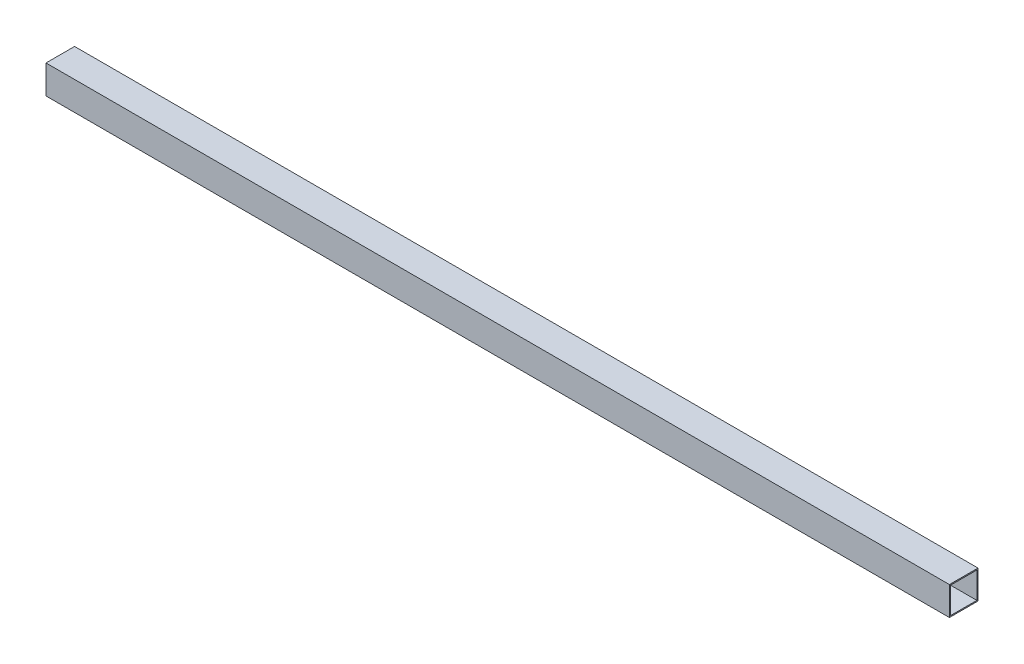
ISO-10303-21;
HEADER;
FILE_DESCRIPTION(('STEP AP214'),'2;1');
FILE_NAME('part.step','',(''),(''),'','','');
FILE_SCHEMA(('AUTOMOTIVE_DESIGN { 1 0 10303 214 1 1 1 1 }'));
ENDSEC;
DATA;
#1=APPLICATION_CONTEXT('core data for automotive mechanical design processes');
#2=APPLICATION_PROTOCOL_DEFINITION('international standard','automotive_design',2000,#1);
#3=PRODUCT_CONTEXT('',#1,'mechanical');
#4=PRODUCT('Part','Part','',(#3));
#5=PRODUCT_RELATED_PRODUCT_CATEGORY('part','',(#4));
#6=PRODUCT_DEFINITION_FORMATION('','',#4);
#7=PRODUCT_DEFINITION_CONTEXT('part definition',#1,'design');
#8=PRODUCT_DEFINITION('design','',#6,#7);
#9=PRODUCT_DEFINITION_SHAPE('','',#8);
#10=(LENGTH_UNIT() NAMED_UNIT(*) SI_UNIT(.MILLI.,.METRE.));
#11=(NAMED_UNIT(*) PLANE_ANGLE_UNIT() SI_UNIT($,.RADIAN.));
#12=(NAMED_UNIT(*) SI_UNIT($,.STERADIAN.) SOLID_ANGLE_UNIT());
#13=UNCERTAINTY_MEASURE_WITH_UNIT(LENGTH_MEASURE(1.E-05),#10,'distance_accuracy_value','');
#14=(GEOMETRIC_REPRESENTATION_CONTEXT(3) GLOBAL_UNCERTAINTY_ASSIGNED_CONTEXT((#13)) GLOBAL_UNIT_ASSIGNED_CONTEXT((#10,
#11,#12)) REPRESENTATION_CONTEXT('',''));
#15=CARTESIAN_POINT('',(0.,0.,0.));
#16=DIRECTION('',(0.,0.,1.));
#17=DIRECTION('',(1.,0.,0.));
#18=AXIS2_PLACEMENT_3D('',#15,#16,#17);
#19=CARTESIAN_POINT('',(790.,-25.,800.));
#20=DIRECTION('',(0.,0.,-1.));
#21=DIRECTION('',(-1.,0.,0.));
#22=AXIS2_PLACEMENT_3D('',#19,#20,#21);
#23=PLANE('',#22);
#24=DIRECTION('',(0.,-1.,0.));
#25=VECTOR('',#24,1.);
#26=CARTESIAN_POINT('',(-790.,0.,800.));
#27=LINE('',#26,#25);
#28=CARTESIAN_POINT('',(-790.,25.,800.));
#29=VERTEX_POINT('',#28);
#30=CARTESIAN_POINT('',(-790.,-25.,800.));
#31=VERTEX_POINT('',#30);
#32=EDGE_CURVE('E136',#29,#31,#27,.T.);
#33=ORIENTED_EDGE('',*,*,#32,.T.);
#34=DIRECTION('',(-1.,0.,0.));
#35=VECTOR('',#34,1.);
#36=CARTESIAN_POINT('',(0.,-25.,800.));
#37=LINE('',#36,#35);
#38=CARTESIAN_POINT('',(790.,-25.,800.));
#39=VERTEX_POINT('',#38);
#40=EDGE_CURVE('E129',#39,#31,#37,.T.);
#41=ORIENTED_EDGE('',*,*,#40,.F.);
#42=DIRECTION('',(0.,1.,0.));
#43=VECTOR('',#42,1.);
#44=CARTESIAN_POINT('',(790.,0.,800.));
#45=LINE('',#44,#43);
#46=CARTESIAN_POINT('',(790.,25.,800.));
#47=VERTEX_POINT('',#46);
#48=EDGE_CURVE('E113',#39,#47,#45,.T.);
#49=ORIENTED_EDGE('',*,*,#48,.T.);
#50=DIRECTION('',(1.,0.,0.));
#51=VECTOR('',#50,1.);
#52=CARTESIAN_POINT('',(0.,25.,800.));
#53=LINE('',#52,#51);
#54=EDGE_CURVE('E116',#29,#47,#53,.T.);
#55=ORIENTED_EDGE('',*,*,#54,.F.);
#56=EDGE_LOOP('',(#33,#41,#49,#55));
#57=FACE_BOUND('',#56,.T.);
#58=ADVANCED_FACE('F16',(#57),#23,.F.);
#59=CARTESIAN_POINT('',(-790.,-23.,798.));
#60=DIRECTION('',(0.,0.,1.));
#61=DIRECTION('',(1.,0.,0.));
#62=AXIS2_PLACEMENT_3D('',#59,#60,#61);
#63=PLANE('',#62);
#64=DIRECTION('',(0.,1.,0.));
#65=VECTOR('',#64,1.);
#66=CARTESIAN_POINT('',(-790.,0.,798.));
#67=LINE('',#66,#65);
#68=CARTESIAN_POINT('',(-790.,-23.,798.));
#69=VERTEX_POINT('',#68);
#70=CARTESIAN_POINT('',(-790.,23.,798.));
#71=VERTEX_POINT('',#70);
#72=EDGE_CURVE('E139',#69,#71,#67,.T.);
#73=ORIENTED_EDGE('',*,*,#72,.T.);
#74=DIRECTION('',(1.,0.,0.));
#75=VECTOR('',#74,1.);
#76=CARTESIAN_POINT('',(0.,23.,798.));
#77=LINE('',#76,#75);
#78=CARTESIAN_POINT('',(790.,23.,798.));
#79=VERTEX_POINT('',#78);
#80=EDGE_CURVE('E20',#71,#79,#77,.T.);
#81=ORIENTED_EDGE('',*,*,#80,.T.);
#82=DIRECTION('',(0.,-1.,0.));
#83=VECTOR('',#82,1.);
#84=CARTESIAN_POINT('',(790.,0.,798.));
#85=LINE('',#84,#83);
#86=CARTESIAN_POINT('',(790.,-23.,798.));
#87=VERTEX_POINT('',#86);
#88=EDGE_CURVE('E79',#79,#87,#85,.T.);
#89=ORIENTED_EDGE('',*,*,#88,.T.);
#90=DIRECTION('',(-1.,0.,0.));
#91=VECTOR('',#90,1.);
#92=CARTESIAN_POINT('',(0.,-23.,798.));
#93=LINE('',#92,#91);
#94=EDGE_CURVE('E82',#87,#69,#93,.T.);
#95=ORIENTED_EDGE('',*,*,#94,.T.);
#96=EDGE_LOOP('',(#73,#81,#89,#95));
#97=FACE_BOUND('',#96,.T.);
#98=ADVANCED_FACE('F81',(#97),#63,.F.);
#99=CARTESIAN_POINT('',(790.,23.,752.));
#100=DIRECTION('',(0.,1.,0.));
#101=DIRECTION('',(-1.,0.,0.));
#102=AXIS2_PLACEMENT_3D('',#99,#100,#101);
#103=PLANE('',#102);
#104=DIRECTION('',(0.,0.,-1.));
#105=VECTOR('',#104,1.);
#106=CARTESIAN_POINT('',(-790.,23.,775.));
#107=LINE('',#106,#105);
#108=CARTESIAN_POINT('',(-790.,23.,752.));
#109=VERTEX_POINT('',#108);
#110=EDGE_CURVE('E123',#71,#109,#107,.T.);
#111=ORIENTED_EDGE('',*,*,#110,.T.);
#112=DIRECTION('',(1.,0.,0.));
#113=VECTOR('',#112,1.);
#114=CARTESIAN_POINT('',(0.,23.,752.));
#115=LINE('',#114,#113);
#116=CARTESIAN_POINT('',(790.,23.,752.));
#117=VERTEX_POINT('',#116);
#118=EDGE_CURVE('E101',#109,#117,#115,.T.);
#119=ORIENTED_EDGE('',*,*,#118,.T.);
#120=DIRECTION('',(0.,0.,1.));
#121=VECTOR('',#120,1.);
#122=CARTESIAN_POINT('',(790.,23.,775.));
#123=LINE('',#122,#121);
#124=EDGE_CURVE('E108',#117,#79,#123,.T.);
#125=ORIENTED_EDGE('',*,*,#124,.T.);
#126=ORIENTED_EDGE('',*,*,#80,.F.);
#127=EDGE_LOOP('',(#111,#119,#125,#126));
#128=FACE_BOUND('',#127,.T.);
#129=ADVANCED_FACE('F121',(#128),#103,.F.);
#130=CARTESIAN_POINT('',(790.,-23.,752.));
#131=DIRECTION('',(0.,0.,-1.));
#132=DIRECTION('',(-1.,0.,0.));
#133=AXIS2_PLACEMENT_3D('',#130,#131,#132);
#134=PLANE('',#133);
#135=DIRECTION('',(0.,-1.,0.));
#136=VECTOR('',#135,1.);
#137=CARTESIAN_POINT('',(-790.,0.,752.));
#138=LINE('',#137,#136);
#139=CARTESIAN_POINT('',(-790.,-23.,752.));
#140=VERTEX_POINT('',#139);
#141=EDGE_CURVE('E142',#109,#140,#138,.T.);
#142=ORIENTED_EDGE('',*,*,#141,.T.);
#143=DIRECTION('',(1.,0.,0.));
#144=VECTOR('',#143,1.);
#145=CARTESIAN_POINT('',(0.,-23.,752.));
#146=LINE('',#145,#144);
#147=CARTESIAN_POINT('',(790.,-23.,752.));
#148=VERTEX_POINT('',#147);
#149=EDGE_CURVE('E100',#140,#148,#146,.T.);
#150=ORIENTED_EDGE('',*,*,#149,.T.);
#151=DIRECTION('',(0.,1.,0.));
#152=VECTOR('',#151,1.);
#153=CARTESIAN_POINT('',(790.,0.,752.));
#154=LINE('',#153,#152);
#155=EDGE_CURVE('E106',#148,#117,#154,.T.);
#156=ORIENTED_EDGE('',*,*,#155,.T.);
#157=ORIENTED_EDGE('',*,*,#118,.F.);
#158=EDGE_LOOP('',(#142,#150,#156,#157));
#159=FACE_BOUND('',#158,.T.);
#160=ADVANCED_FACE('F126',(#159),#134,.F.);
#161=CARTESIAN_POINT('',(-790.,-23.,798.));
#162=DIRECTION('',(0.,-1.,0.));
#163=DIRECTION('',(0.,0.,-1.));
#164=AXIS2_PLACEMENT_3D('',#161,#162,#163);
#165=PLANE('',#164);
#166=DIRECTION('',(0.,0.,1.));
#167=VECTOR('',#166,1.);
#168=CARTESIAN_POINT('',(-790.,-23.,775.));
#169=LINE('',#168,#167);
#170=EDGE_CURVE('E98',#140,#69,#169,.T.);
#171=ORIENTED_EDGE('',*,*,#170,.T.);
#172=ORIENTED_EDGE('',*,*,#94,.F.);
#173=DIRECTION('',(0.,0.,-1.));
#174=VECTOR('',#173,1.);
#175=CARTESIAN_POINT('',(790.,-23.,775.));
#176=LINE('',#175,#174);
#177=EDGE_CURVE('E89',#87,#148,#176,.T.);
#178=ORIENTED_EDGE('',*,*,#177,.T.);
#179=ORIENTED_EDGE('',*,*,#149,.F.);
#180=EDGE_LOOP('',(#171,#172,#178,#179));
#181=FACE_BOUND('',#180,.T.);
#182=ADVANCED_FACE('F94',(#181),#165,.F.);
#183=CARTESIAN_POINT('',(-790.,25.,750.));
#184=DIRECTION('',(0.,1.,0.));
#185=DIRECTION('',(0.,0.,1.));
#186=AXIS2_PLACEMENT_3D('',#183,#184,#185);
#187=PLANE('',#186);
#188=DIRECTION('',(0.,0.,1.));
#189=VECTOR('',#188,1.);
#190=CARTESIAN_POINT('',(-790.,25.,775.));
#191=LINE('',#190,#189);
#192=CARTESIAN_POINT('',(-790.,25.,750.));
#193=VERTEX_POINT('',#192);
#194=EDGE_CURVE('E133',#193,#29,#191,.T.);
#195=ORIENTED_EDGE('',*,*,#194,.T.);
#196=ORIENTED_EDGE('',*,*,#54,.T.);
#197=DIRECTION('',(0.,0.,-1.));
#198=VECTOR('',#197,1.);
#199=CARTESIAN_POINT('',(790.,25.,775.));
#200=LINE('',#199,#198);
#201=CARTESIAN_POINT('',(790.,25.,750.));
#202=VERTEX_POINT('',#201);
#203=EDGE_CURVE('E90',#47,#202,#200,.T.);
#204=ORIENTED_EDGE('',*,*,#203,.T.);
#205=DIRECTION('',(1.,0.,0.));
#206=VECTOR('',#205,1.);
#207=CARTESIAN_POINT('',(0.,25.,750.));
#208=LINE('',#207,#206);
#209=EDGE_CURVE('E145',#193,#202,#208,.T.);
#210=ORIENTED_EDGE('',*,*,#209,.F.);
#211=EDGE_LOOP('',(#195,#196,#204,#210));
#212=FACE_BOUND('',#211,.T.);
#213=ADVANCED_FACE('F163',(#212),#187,.T.);
#214=CARTESIAN_POINT('',(790.,-25.,750.));
#215=DIRECTION('',(-1.,0.,0.));
#216=DIRECTION('',(0.,0.,1.));
#217=AXIS2_PLACEMENT_3D('',#214,#215,#216);
#218=PLANE('',#217);
#219=ORIENTED_EDGE('',*,*,#155,.F.);
#220=ORIENTED_EDGE('',*,*,#177,.F.);
#221=ORIENTED_EDGE('',*,*,#88,.F.);
#222=ORIENTED_EDGE('',*,*,#124,.F.);
#223=EDGE_LOOP('',(#219,#220,#221,#222));
#224=FACE_BOUND('',#223,.T.);
#225=ORIENTED_EDGE('',*,*,#48,.F.);
#226=DIRECTION('',(0.,0.,1.));
#227=VECTOR('',#226,1.);
#228=CARTESIAN_POINT('',(790.,-25.,775.));
#229=LINE('',#228,#227);
#230=CARTESIAN_POINT('',(790.,-25.,750.));
#231=VERTEX_POINT('',#230);
#232=EDGE_CURVE('E127',#231,#39,#229,.T.);
#233=ORIENTED_EDGE('',*,*,#232,.F.);
#234=DIRECTION('',(0.,-1.,0.));
#235=VECTOR('',#234,1.);
#236=CARTESIAN_POINT('',(790.,0.,750.));
#237=LINE('',#236,#235);
#238=EDGE_CURVE('E148',#202,#231,#237,.T.);
#239=ORIENTED_EDGE('',*,*,#238,.F.);
#240=ORIENTED_EDGE('',*,*,#203,.F.);
#241=EDGE_LOOP('',(#225,#233,#239,#240));
#242=FACE_BOUND('',#241,.T.);
#243=ADVANCED_FACE('F103',(#224,#242),#218,.F.);
#244=CARTESIAN_POINT('',(-790.,-25.,800.));
#245=DIRECTION('',(0.,-1.,0.));
#246=DIRECTION('',(0.,0.,-1.));
#247=AXIS2_PLACEMENT_3D('',#244,#245,#246);
#248=PLANE('',#247);
#249=ORIENTED_EDGE('',*,*,#232,.T.);
#250=ORIENTED_EDGE('',*,*,#40,.T.);
#251=DIRECTION('',(0.,0.,-1.));
#252=VECTOR('',#251,1.);
#253=CARTESIAN_POINT('',(-790.,-25.,775.));
#254=LINE('',#253,#252);
#255=CARTESIAN_POINT('',(-790.,-25.,750.));
#256=VERTEX_POINT('',#255);
#257=EDGE_CURVE('E35',#31,#256,#254,.T.);
#258=ORIENTED_EDGE('',*,*,#257,.T.);
#259=DIRECTION('',(-1.,0.,0.));
#260=VECTOR('',#259,1.);
#261=CARTESIAN_POINT('',(0.,-25.,750.));
#262=LINE('',#261,#260);
#263=EDGE_CURVE('E26',#231,#256,#262,.T.);
#264=ORIENTED_EDGE('',*,*,#263,.F.);
#265=EDGE_LOOP('',(#249,#250,#258,#264));
#266=FACE_BOUND('',#265,.T.);
#267=ADVANCED_FACE('F154',(#266),#248,.T.);
#268=CARTESIAN_POINT('',(-790.,-25.,800.));
#269=DIRECTION('',(1.,0.,0.));
#270=DIRECTION('',(0.,0.,-1.));
#271=AXIS2_PLACEMENT_3D('',#268,#269,#270);
#272=PLANE('',#271);
#273=ORIENTED_EDGE('',*,*,#141,.F.);
#274=ORIENTED_EDGE('',*,*,#110,.F.);
#275=ORIENTED_EDGE('',*,*,#72,.F.);
#276=ORIENTED_EDGE('',*,*,#170,.F.);
#277=EDGE_LOOP('',(#273,#274,#275,#276));
#278=FACE_BOUND('',#277,.T.);
#279=ORIENTED_EDGE('',*,*,#257,.F.);
#280=ORIENTED_EDGE('',*,*,#32,.F.);
#281=ORIENTED_EDGE('',*,*,#194,.F.);
#282=DIRECTION('',(0.,1.,0.));
#283=VECTOR('',#282,1.);
#284=CARTESIAN_POINT('',(-790.,0.,750.));
#285=LINE('',#284,#283);
#286=EDGE_CURVE('E11',#256,#193,#285,.T.);
#287=ORIENTED_EDGE('',*,*,#286,.F.);
#288=EDGE_LOOP('',(#279,#280,#281,#287));
#289=FACE_BOUND('',#288,.T.);
#290=ADVANCED_FACE('F161',(#278,#289),#272,.F.);
#291=CARTESIAN_POINT('',(790.,-25.,750.));
#292=DIRECTION('',(0.,0.,-1.));
#293=DIRECTION('',(-1.,0.,0.));
#294=AXIS2_PLACEMENT_3D('',#291,#292,#293);
#295=PLANE('',#294);
#296=ORIENTED_EDGE('',*,*,#263,.T.);
#297=ORIENTED_EDGE('',*,*,#286,.T.);
#298=ORIENTED_EDGE('',*,*,#209,.T.);
#299=ORIENTED_EDGE('',*,*,#238,.T.);
#300=EDGE_LOOP('',(#296,#297,#298,#299));
#301=FACE_BOUND('',#300,.T.);
#302=ADVANCED_FACE('F18',(#301),#295,.T.);
#303=CLOSED_SHELL('',(#58,#98,#129,#160,#182,#213,#243,#267,#290,#302));
#304=MANIFOLD_SOLID_BREP('B1',#303);
#305=ADVANCED_BREP_SHAPE_REPRESENTATION('',(#18,#304),#14);
#306=SHAPE_DEFINITION_REPRESENTATION(#9,#305);
ENDSEC;
END-ISO-10303-21;
